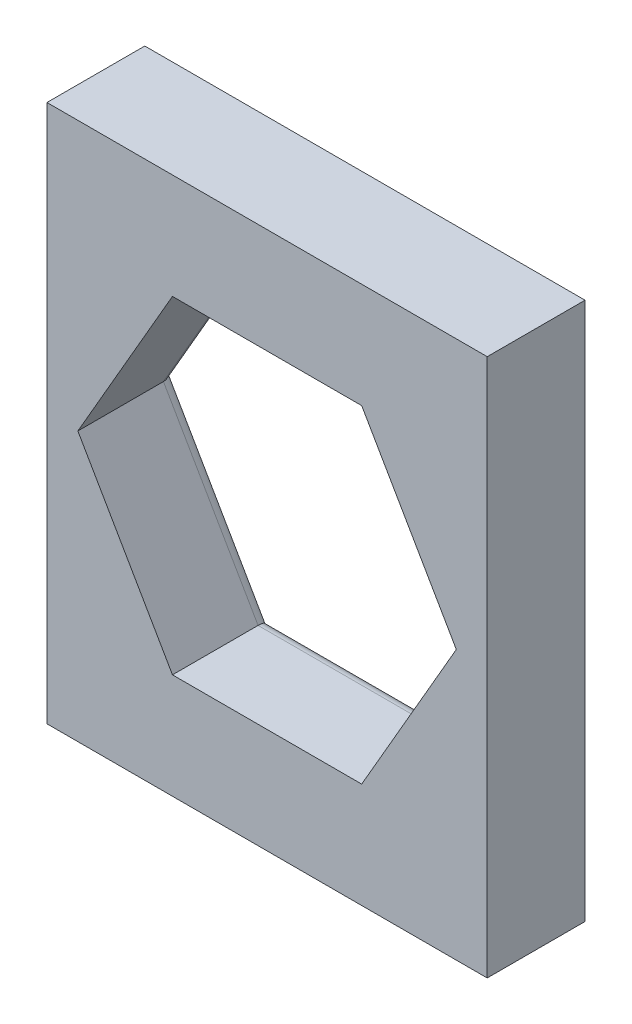
ISO-10303-21;
HEADER;
FILE_DESCRIPTION(('STEP AP214'),'2;1');
FILE_NAME('part.step','',(''),(''),'','','');
FILE_SCHEMA(('AUTOMOTIVE_DESIGN { 1 0 10303 214 1 1 1 1 }'));
ENDSEC;
DATA;
#1=APPLICATION_CONTEXT('core data for automotive mechanical design processes');
#2=APPLICATION_PROTOCOL_DEFINITION('international standard','automotive_design',2000,#1);
#3=PRODUCT_CONTEXT('',#1,'mechanical');
#4=PRODUCT('Part','Part','',(#3));
#5=PRODUCT_RELATED_PRODUCT_CATEGORY('part','',(#4));
#6=PRODUCT_DEFINITION_FORMATION('','',#4);
#7=PRODUCT_DEFINITION_CONTEXT('part definition',#1,'design');
#8=PRODUCT_DEFINITION('design','',#6,#7);
#9=PRODUCT_DEFINITION_SHAPE('','',#8);
#10=(LENGTH_UNIT() NAMED_UNIT(*) SI_UNIT(.MILLI.,.METRE.));
#11=(NAMED_UNIT(*) PLANE_ANGLE_UNIT() SI_UNIT($,.RADIAN.));
#12=(NAMED_UNIT(*) SI_UNIT($,.STERADIAN.) SOLID_ANGLE_UNIT());
#13=UNCERTAINTY_MEASURE_WITH_UNIT(LENGTH_MEASURE(1.E-05),#10,'distance_accuracy_value','');
#14=(GEOMETRIC_REPRESENTATION_CONTEXT(3) GLOBAL_UNCERTAINTY_ASSIGNED_CONTEXT((#13)) GLOBAL_UNIT_ASSIGNED_CONTEXT((#10,
#11,#12)) REPRESENTATION_CONTEXT('',''));
#15=CARTESIAN_POINT('',(0.,0.,0.));
#16=DIRECTION('',(0.,0.,1.));
#17=DIRECTION('',(1.,0.,0.));
#18=AXIS2_PLACEMENT_3D('',#15,#16,#17);
#19=CARTESIAN_POINT('',(53.6875782465025,43.1093909877878,89.839785791764));
#20=DIRECTION('',(0.,1.,0.));
#21=DIRECTION('',(0.,0.,1.));
#22=AXIS2_PLACEMENT_3D('',#19,#20,#21);
#23=PLANE('',#22);
#24=DIRECTION('',(1.,0.,0.));
#25=VECTOR('',#24,1.);
#26=CARTESIAN_POINT('',(53.6875782465025,43.1093909877878,87.139785791764));
#27=LINE('',#26,#25);
#28=CARTESIAN_POINT('',(53.6875782465025,43.1093909877878,87.139785791764));
#29=VERTEX_POINT('',#28);
#30=CARTESIAN_POINT('',(61.4240718536434,43.1093909877878,87.139785791764));
#31=VERTEX_POINT('',#30);
#32=EDGE_CURVE('E151',#29,#31,#27,.T.);
#33=ORIENTED_EDGE('',*,*,#32,.F.);
#34=DIRECTION('',(0.,0.,-1.));
#35=VECTOR('',#34,1.);
#36=CARTESIAN_POINT('',(53.6875782465025,43.1093909877878,89.839785791764));
#37=LINE('',#36,#35);
#38=CARTESIAN_POINT('',(53.6875782465025,43.1093909877878,83.639785791764));
#39=VERTEX_POINT('',#38);
#40=EDGE_CURVE('E199',#29,#39,#37,.T.);
#41=ORIENTED_EDGE('',*,*,#40,.T.);
#42=DIRECTION('',(1.,0.,0.));
#43=VECTOR('',#42,1.);
#44=CARTESIAN_POINT('',(61.4240718536434,43.1093909877878,83.639785791764));
#45=LINE('',#44,#43);
#46=CARTESIAN_POINT('',(61.4240718536434,43.1093909877878,83.639785791764));
#47=VERTEX_POINT('',#46);
#48=EDGE_CURVE('E223',#39,#47,#45,.T.);
#49=ORIENTED_EDGE('',*,*,#48,.T.);
#50=DIRECTION('',(0.,0.,-1.));
#51=VECTOR('',#50,1.);
#52=CARTESIAN_POINT('',(61.4240718536434,43.1093909877878,89.839785791764));
#53=LINE('',#52,#51);
#54=EDGE_CURVE('E197',#31,#47,#53,.T.);
#55=ORIENTED_EDGE('',*,*,#54,.F.);
#56=EDGE_LOOP('',(#33,#41,#49,#55));
#57=FACE_BOUND('',#56,.T.);
#58=ADVANCED_FACE('F41',(#57),#23,.F.);
#59=CARTESIAN_POINT('',(61.4240718536434,43.1093909877878,89.839785791764));
#60=DIRECTION('',(0.866025403784439,0.5,0.));
#61=DIRECTION('',(-0.5,0.866025403784439,0.));
#62=AXIS2_PLACEMENT_3D('',#59,#60,#61);
#63=PLANE('',#62);
#64=DIRECTION('',(0.5,-0.866025403784439,0.));
#65=VECTOR('',#64,1.);
#66=CARTESIAN_POINT('',(61.4240718536434,43.1093909877878,87.139785791764));
#67=LINE('',#66,#65);
#68=CARTESIAN_POINT('',(65.292318657214,36.4093909877877,87.139785791764));
#69=VERTEX_POINT('',#68);
#70=EDGE_CURVE('E188',#31,#69,#67,.T.);
#71=ORIENTED_EDGE('',*,*,#70,.F.);
#72=ORIENTED_EDGE('',*,*,#54,.T.);
#73=DIRECTION('',(0.5,-0.866025403784439,0.));
#74=VECTOR('',#73,1.);
#75=CARTESIAN_POINT('',(65.292318657214,36.4093909877877,83.639785791764));
#76=LINE('',#75,#74);
#77=CARTESIAN_POINT('',(65.292318657214,36.4093909877877,83.639785791764));
#78=VERTEX_POINT('',#77);
#79=EDGE_CURVE('E226',#47,#78,#76,.T.);
#80=ORIENTED_EDGE('',*,*,#79,.T.);
#81=DIRECTION('',(0.,0.,-1.));
#82=VECTOR('',#81,1.);
#83=CARTESIAN_POINT('',(65.292318657214,36.4093909877877,89.839785791764));
#84=LINE('',#83,#82);
#85=EDGE_CURVE('E195',#69,#78,#84,.T.);
#86=ORIENTED_EDGE('',*,*,#85,.F.);
#87=EDGE_LOOP('',(#71,#72,#80,#86));
#88=FACE_BOUND('',#87,.T.);
#89=ADVANCED_FACE('F287',(#88),#63,.F.);
#90=CARTESIAN_POINT('',(65.292318657214,36.4093909877877,89.839785791764));
#91=DIRECTION('',(0.866025403784438,-0.5,0.));
#92=DIRECTION('',(0.5,0.866025403784438,0.));
#93=AXIS2_PLACEMENT_3D('',#90,#91,#92);
#94=PLANE('',#93);
#95=DIRECTION('',(-0.5,-0.866025403784438,0.));
#96=VECTOR('',#95,1.);
#97=CARTESIAN_POINT('',(65.292318657214,36.4093909877877,87.139785791764));
#98=LINE('',#97,#96);
#99=CARTESIAN_POINT('',(61.4240718536434,29.7093909877877,87.139785791764));
#100=VERTEX_POINT('',#99);
#101=EDGE_CURVE('E186',#69,#100,#98,.T.);
#102=ORIENTED_EDGE('',*,*,#101,.F.);
#103=ORIENTED_EDGE('',*,*,#85,.T.);
#104=DIRECTION('',(-0.5,-0.866025403784438,0.));
#105=VECTOR('',#104,1.);
#106=CARTESIAN_POINT('',(61.4240718536434,29.7093909877877,83.639785791764));
#107=LINE('',#106,#105);
#108=CARTESIAN_POINT('',(61.4240718536434,29.7093909877877,83.639785791764));
#109=VERTEX_POINT('',#108);
#110=EDGE_CURVE('E12',#78,#109,#107,.T.);
#111=ORIENTED_EDGE('',*,*,#110,.T.);
#112=DIRECTION('',(0.,0.,-1.));
#113=VECTOR('',#112,1.);
#114=CARTESIAN_POINT('',(61.4240718536434,29.7093909877877,89.839785791764));
#115=LINE('',#114,#113);
#116=EDGE_CURVE('E66',#100,#109,#115,.T.);
#117=ORIENTED_EDGE('',*,*,#116,.F.);
#118=EDGE_LOOP('',(#102,#103,#111,#117));
#119=FACE_BOUND('',#118,.T.);
#120=ADVANCED_FACE('F289',(#119),#94,.F.);
#121=CARTESIAN_POINT('',(61.4240718536434,29.7093909877877,89.839785791764));
#122=DIRECTION('',(0.,-1.,0.));
#123=DIRECTION('',(1.,0.,0.));
#124=AXIS2_PLACEMENT_3D('',#121,#122,#123);
#125=PLANE('',#124);
#126=DIRECTION('',(-1.,0.,0.));
#127=VECTOR('',#126,1.);
#128=CARTESIAN_POINT('',(61.4240718536434,29.7093909877877,87.139785791764));
#129=LINE('',#128,#127);
#130=CARTESIAN_POINT('',(53.6875782465024,29.7093909877877,87.139785791764));
#131=VERTEX_POINT('',#130);
#132=EDGE_CURVE('E184',#100,#131,#129,.T.);
#133=ORIENTED_EDGE('',*,*,#132,.F.);
#134=ORIENTED_EDGE('',*,*,#116,.T.);
#135=DIRECTION('',(-1.,0.,0.));
#136=VECTOR('',#135,1.);
#137=CARTESIAN_POINT('',(53.6875782465024,29.7093909877877,83.639785791764));
#138=LINE('',#137,#136);
#139=CARTESIAN_POINT('',(53.6875782465024,29.7093909877877,83.639785791764));
#140=VERTEX_POINT('',#139);
#141=EDGE_CURVE('E50',#109,#140,#138,.T.);
#142=ORIENTED_EDGE('',*,*,#141,.T.);
#143=DIRECTION('',(0.,0.,-1.));
#144=VECTOR('',#143,1.);
#145=CARTESIAN_POINT('',(53.6875782465024,29.7093909877877,89.839785791764));
#146=LINE('',#145,#144);
#147=EDGE_CURVE('E203',#131,#140,#146,.T.);
#148=ORIENTED_EDGE('',*,*,#147,.F.);
#149=EDGE_LOOP('',(#133,#134,#142,#148));
#150=FACE_BOUND('',#149,.T.);
#151=ADVANCED_FACE('F264',(#150),#125,.F.);
#152=CARTESIAN_POINT('',(53.6875782465024,29.7093909877877,89.839785791764));
#153=DIRECTION('',(-0.866025403784439,-0.5,0.));
#154=DIRECTION('',(0.5,-0.866025403784439,0.));
#155=AXIS2_PLACEMENT_3D('',#152,#153,#154);
#156=PLANE('',#155);
#157=DIRECTION('',(-0.5,0.866025403784439,0.));
#158=VECTOR('',#157,1.);
#159=CARTESIAN_POINT('',(53.6875782465024,29.7093909877877,87.139785791764));
#160=LINE('',#159,#158);
#161=CARTESIAN_POINT('',(49.8193314429319,36.4093909877877,87.139785791764));
#162=VERTEX_POINT('',#161);
#163=EDGE_CURVE('E58',#131,#162,#160,.T.);
#164=ORIENTED_EDGE('',*,*,#163,.F.);
#165=ORIENTED_EDGE('',*,*,#147,.T.);
#166=DIRECTION('',(-0.5,0.866025403784439,0.));
#167=VECTOR('',#166,1.);
#168=CARTESIAN_POINT('',(49.8193314429319,36.4093909877877,83.639785791764));
#169=LINE('',#168,#167);
#170=CARTESIAN_POINT('',(49.8193314429319,36.4093909877877,83.639785791764));
#171=VERTEX_POINT('',#170);
#172=EDGE_CURVE('E194',#140,#171,#169,.T.);
#173=ORIENTED_EDGE('',*,*,#172,.T.);
#174=DIRECTION('',(0.,0.,-1.));
#175=VECTOR('',#174,1.);
#176=CARTESIAN_POINT('',(49.8193314429319,36.4093909877877,89.839785791764));
#177=LINE('',#176,#175);
#178=EDGE_CURVE('E201',#162,#171,#177,.T.);
#179=ORIENTED_EDGE('',*,*,#178,.F.);
#180=EDGE_LOOP('',(#164,#165,#173,#179));
#181=FACE_BOUND('',#180,.T.);
#182=ADVANCED_FACE('F266',(#181),#156,.F.);
#183=CARTESIAN_POINT('',(49.8193314429319,36.4093909877877,89.839785791764));
#184=DIRECTION('',(-0.866025403784439,0.5,0.));
#185=DIRECTION('',(-0.5,-0.866025403784439,0.));
#186=AXIS2_PLACEMENT_3D('',#183,#184,#185);
#187=PLANE('',#186);
#188=DIRECTION('',(0.5,0.866025403784439,0.));
#189=VECTOR('',#188,1.);
#190=CARTESIAN_POINT('',(49.8193314429319,36.4093909877877,87.139785791764));
#191=LINE('',#190,#189);
#192=EDGE_CURVE('E181',#162,#29,#191,.T.);
#193=ORIENTED_EDGE('',*,*,#192,.F.);
#194=ORIENTED_EDGE('',*,*,#178,.T.);
#195=DIRECTION('',(0.5,0.866025403784439,0.));
#196=VECTOR('',#195,1.);
#197=CARTESIAN_POINT('',(53.6875782465025,43.1093909877878,83.639785791764));
#198=LINE('',#197,#196);
#199=EDGE_CURVE('E220',#171,#39,#198,.T.);
#200=ORIENTED_EDGE('',*,*,#199,.T.);
#201=ORIENTED_EDGE('',*,*,#40,.F.);
#202=EDGE_LOOP('',(#193,#194,#200,#201));
#203=FACE_BOUND('',#202,.T.);
#204=ADVANCED_FACE('F269',(#203),#187,.F.);
#205=CARTESIAN_POINT('',(48.5558250500729,45.4093909877877,131.180666914685));
#206=DIRECTION('',(1.,0.,0.));
#207=DIRECTION('',(0.,0.,-1.));
#208=AXIS2_PLACEMENT_3D('',#205,#206,#207);
#209=PLANE('',#208);
#210=DIRECTION('',(0.,-1.,0.));
#211=VECTOR('',#210,1.);
#212=CARTESIAN_POINT('',(48.5558250500729,45.4093909877877,87.139785791764));
#213=LINE('',#212,#211);
#214=CARTESIAN_POINT('',(48.5558250500729,47.4093909877877,87.139785791764));
#215=VERTEX_POINT('',#214);
#216=CARTESIAN_POINT('',(48.5558250500729,25.4093909877877,87.139785791764));
#217=VERTEX_POINT('',#216);
#218=EDGE_CURVE('E179',#215,#217,#213,.T.);
#219=ORIENTED_EDGE('',*,*,#218,.F.);
#220=DIRECTION('',(0.,0.,1.));
#221=VECTOR('',#220,1.);
#222=CARTESIAN_POINT('',(48.5558250500729,47.4093909877877,65.0290155154891));
#223=LINE('',#222,#221);
#224=CARTESIAN_POINT('',(48.5558250500729,47.4093909877877,83.139785791764));
#225=VERTEX_POINT('',#224);
#226=EDGE_CURVE('E146',#225,#215,#223,.T.);
#227=ORIENTED_EDGE('',*,*,#226,.F.);
#228=DIRECTION('',(0.,-1.,0.));
#229=VECTOR('',#228,1.);
#230=CARTESIAN_POINT('',(48.5558250500729,0.,83.139785791764));
#231=LINE('',#230,#229);
#232=CARTESIAN_POINT('',(48.5558250500729,25.4093909877877,83.139785791764));
#233=VERTEX_POINT('',#232);
#234=EDGE_CURVE('E139',#225,#233,#231,.T.);
#235=ORIENTED_EDGE('',*,*,#234,.T.);
#236=DIRECTION('',(0.,0.,1.));
#237=VECTOR('',#236,1.);
#238=CARTESIAN_POINT('',(48.5558250500729,25.4093909877877,65.0290155154891));
#239=LINE('',#238,#237);
#240=EDGE_CURVE('E143',#233,#217,#239,.T.);
#241=ORIENTED_EDGE('',*,*,#240,.T.);
#242=EDGE_LOOP('',(#219,#227,#235,#241));
#243=FACE_BOUND('',#242,.T.);
#244=ADVANCED_FACE('F141',(#243),#209,.F.);
#245=CARTESIAN_POINT('',(66.5558250500729,45.4093909877877,131.180666914685));
#246=DIRECTION('',(-1.,0.,0.));
#247=DIRECTION('',(0.,0.,1.));
#248=AXIS2_PLACEMENT_3D('',#245,#246,#247);
#249=PLANE('',#248);
#250=DIRECTION('',(0.,1.,0.));
#251=VECTOR('',#250,1.);
#252=CARTESIAN_POINT('',(66.5558250500729,45.4093909877877,87.139785791764));
#253=LINE('',#252,#251);
#254=CARTESIAN_POINT('',(66.5558250500729,25.4093909877877,87.139785791764));
#255=VERTEX_POINT('',#254);
#256=CARTESIAN_POINT('',(66.5558250500729,47.4093909877877,87.139785791764));
#257=VERTEX_POINT('',#256);
#258=EDGE_CURVE('E177',#255,#257,#253,.T.);
#259=ORIENTED_EDGE('',*,*,#258,.F.);
#260=DIRECTION('',(0.,0.,1.));
#261=VECTOR('',#260,1.);
#262=CARTESIAN_POINT('',(66.5558250500729,25.4093909877877,65.0290155154891));
#263=LINE('',#262,#261);
#264=CARTESIAN_POINT('',(66.5558250500729,25.4093909877877,83.139785791764));
#265=VERTEX_POINT('',#264);
#266=EDGE_CURVE('E164',#265,#255,#263,.T.);
#267=ORIENTED_EDGE('',*,*,#266,.F.);
#268=DIRECTION('',(0.,1.,0.));
#269=VECTOR('',#268,1.);
#270=CARTESIAN_POINT('',(66.5558250500729,0.,83.139785791764));
#271=LINE('',#270,#269);
#272=CARTESIAN_POINT('',(66.5558250500729,47.4093909877877,83.139785791764));
#273=VERTEX_POINT('',#272);
#274=EDGE_CURVE('E150',#265,#273,#271,.T.);
#275=ORIENTED_EDGE('',*,*,#274,.T.);
#276=DIRECTION('',(0.,0.,1.));
#277=VECTOR('',#276,1.);
#278=CARTESIAN_POINT('',(66.5558250500729,47.4093909877877,65.0290155154891));
#279=LINE('',#278,#277);
#280=EDGE_CURVE('E171',#273,#257,#279,.T.);
#281=ORIENTED_EDGE('',*,*,#280,.T.);
#282=EDGE_LOOP('',(#259,#267,#275,#281));
#283=FACE_BOUND('',#282,.T.);
#284=ADVANCED_FACE('F318',(#283),#249,.F.);
#285=CARTESIAN_POINT('',(53.6875782465025,43.6093909877878,83.639785791764));
#286=DIRECTION('',(-1.,0.,0.));
#287=DIRECTION('',(0.,0.,1.));
#288=AXIS2_PLACEMENT_3D('',#285,#286,#287);
#289=CYLINDRICAL_SURFACE('',#288,0.5);
#290=CARTESIAN_POINT('',(61.7127469882383,43.6093909877878,83.639785791764));
#291=DIRECTION('',(-0.866025403784439,0.5,0.));
#292=DIRECTION('',(-0.5,-0.866025403784439,0.));
#293=AXIS2_PLACEMENT_3D('',#290,#291,#292);
#294=ELLIPSE('',#293,0.577350269189626,0.5);
#295=CARTESIAN_POINT('',(61.7127469882383,43.6093909877878,83.139785791764));
#296=VERTEX_POINT('',#295);
#297=EDGE_CURVE('E239',#296,#47,#294,.T.);
#298=ORIENTED_EDGE('',*,*,#297,.T.);
#299=ORIENTED_EDGE('',*,*,#48,.F.);
#300=CARTESIAN_POINT('',(53.3989031119076,43.6093909877878,83.639785791764));
#301=DIRECTION('',(-0.866025403784439,-0.5,0.));
#302=DIRECTION('',(0.5,-0.866025403784439,0.));
#303=AXIS2_PLACEMENT_3D('',#300,#301,#302);
#304=ELLIPSE('',#303,0.577350269189626,0.5);
#305=CARTESIAN_POINT('',(53.3989031119076,43.6093909877878,83.139785791764));
#306=VERTEX_POINT('',#305);
#307=EDGE_CURVE('E234',#306,#39,#304,.T.);
#308=ORIENTED_EDGE('',*,*,#307,.F.);
#309=DIRECTION('',(1.,0.,0.));
#310=VECTOR('',#309,1.);
#311=CARTESIAN_POINT('',(53.6875782465025,43.6093909877878,83.139785791764));
#312=LINE('',#311,#310);
#313=EDGE_CURVE('E213',#296,#306,#312,.F.);
#314=ORIENTED_EDGE('',*,*,#313,.F.);
#315=EDGE_LOOP('',(#298,#299,#308,#314));
#316=FACE_BOUND('',#315,.T.);
#317=ADVANCED_FACE('F278',(#316),#289,.T.);
#318=CARTESIAN_POINT('',(61.8570845555357,43.3593909877878,83.639785791764));
#319=DIRECTION('',(-0.5,0.866025403784439,0.));
#320=DIRECTION('',(-0.866025403784439,-0.5,0.));
#321=AXIS2_PLACEMENT_3D('',#318,#319,#320);
#322=CYLINDRICAL_SURFACE('',#321,0.5);
#323=ORIENTED_EDGE('',*,*,#297,.F.);
#324=DIRECTION('',(0.5,-0.866025403784439,0.));
#325=VECTOR('',#324,1.);
#326=CARTESIAN_POINT('',(61.8570845555357,43.3593909877878,83.139785791764));
#327=LINE('',#326,#325);
#328=CARTESIAN_POINT('',(65.8696689264036,36.4093909877877,83.139785791764));
#329=VERTEX_POINT('',#328);
#330=EDGE_CURVE('E211',#329,#296,#327,.F.);
#331=ORIENTED_EDGE('',*,*,#330,.F.);
#332=CARTESIAN_POINT('',(65.8696689264036,36.4093909877877,83.639785791764));
#333=DIRECTION('',(0.,1.,0.));
#334=DIRECTION('',(-1.,0.,0.));
#335=AXIS2_PLACEMENT_3D('',#332,#333,#334);
#336=ELLIPSE('',#335,0.577350269189626,0.5);
#337=EDGE_CURVE('E45',#78,#329,#336,.F.);
#338=ORIENTED_EDGE('',*,*,#337,.F.);
#339=ORIENTED_EDGE('',*,*,#79,.F.);
#340=EDGE_LOOP('',(#323,#331,#338,#339));
#341=FACE_BOUND('',#340,.T.);
#342=ADVANCED_FACE('F43',(#341),#322,.T.);
#343=CARTESIAN_POINT('',(65.7253313591062,36.1593909877877,83.639785791764));
#344=DIRECTION('',(0.5,0.866025403784438,0.));
#345=DIRECTION('',(-0.866025403784438,0.5,0.));
#346=AXIS2_PLACEMENT_3D('',#343,#344,#345);
#347=CYLINDRICAL_SURFACE('',#346,0.5);
#348=ORIENTED_EDGE('',*,*,#337,.T.);
#349=DIRECTION('',(-0.5,-0.866025403784438,0.));
#350=VECTOR('',#349,1.);
#351=CARTESIAN_POINT('',(65.7253313591062,36.1593909877877,83.139785791764));
#352=LINE('',#351,#350);
#353=CARTESIAN_POINT('',(61.7127469882383,29.2093909877877,83.139785791764));
#354=VERTEX_POINT('',#353);
#355=EDGE_CURVE('E207',#354,#329,#352,.F.);
#356=ORIENTED_EDGE('',*,*,#355,.F.);
#357=CARTESIAN_POINT('',(61.7127469882383,29.2093909877877,83.639785791764));
#358=DIRECTION('',(0.866025403784439,0.5,0.));
#359=DIRECTION('',(0.5,-0.866025403784439,0.));
#360=AXIS2_PLACEMENT_3D('',#357,#358,#359);
#361=ELLIPSE('',#360,0.577350269189626,0.5);
#362=EDGE_CURVE('E237',#109,#354,#361,.F.);
#363=ORIENTED_EDGE('',*,*,#362,.F.);
#364=ORIENTED_EDGE('',*,*,#110,.F.);
#365=EDGE_LOOP('',(#348,#356,#363,#364));
#366=FACE_BOUND('',#365,.T.);
#367=ADVANCED_FACE('F250',(#366),#347,.T.);
#368=CARTESIAN_POINT('',(61.4240718536434,29.2093909877877,83.639785791764));
#369=DIRECTION('',(1.,0.,0.));
#370=DIRECTION('',(0.,1.,0.));
#371=AXIS2_PLACEMENT_3D('',#368,#369,#370);
#372=CYLINDRICAL_SURFACE('',#371,0.5);
#373=ORIENTED_EDGE('',*,*,#362,.T.);
#374=DIRECTION('',(-1.,0.,0.));
#375=VECTOR('',#374,1.);
#376=CARTESIAN_POINT('',(61.4240718536434,29.2093909877877,83.139785791764));
#377=LINE('',#376,#375);
#378=CARTESIAN_POINT('',(53.3989031119076,29.2093909877877,83.139785791764));
#379=VERTEX_POINT('',#378);
#380=EDGE_CURVE('E209',#379,#354,#377,.F.);
#381=ORIENTED_EDGE('',*,*,#380,.F.);
#382=CARTESIAN_POINT('',(53.3989031119076,29.2093909877877,83.639785791764));
#383=DIRECTION('',(0.866025403784439,-0.5,0.));
#384=DIRECTION('',(-0.5,-0.866025403784439,0.));
#385=AXIS2_PLACEMENT_3D('',#382,#383,#384);
#386=ELLIPSE('',#385,0.577350269189626,0.5);
#387=EDGE_CURVE('E232',#140,#379,#386,.F.);
#388=ORIENTED_EDGE('',*,*,#387,.F.);
#389=ORIENTED_EDGE('',*,*,#141,.F.);
#390=EDGE_LOOP('',(#373,#381,#388,#389));
#391=FACE_BOUND('',#390,.T.);
#392=ADVANCED_FACE('F260',(#391),#372,.T.);
#393=CARTESIAN_POINT('',(53.2545655446102,29.4593909877877,83.639785791764));
#394=DIRECTION('',(0.5,-0.866025403784439,0.));
#395=DIRECTION('',(0.866025403784439,0.5,0.));
#396=AXIS2_PLACEMENT_3D('',#393,#394,#395);
#397=CYLINDRICAL_SURFACE('',#396,0.5);
#398=ORIENTED_EDGE('',*,*,#387,.T.);
#399=DIRECTION('',(-0.5,0.866025403784439,0.));
#400=VECTOR('',#399,1.);
#401=CARTESIAN_POINT('',(53.2545655446102,29.4593909877877,83.139785791764));
#402=LINE('',#401,#400);
#403=CARTESIAN_POINT('',(49.2419811737423,36.4093909877877,83.139785791764));
#404=VERTEX_POINT('',#403);
#405=EDGE_CURVE('E217',#404,#379,#402,.F.);
#406=ORIENTED_EDGE('',*,*,#405,.F.);
#407=CARTESIAN_POINT('',(49.2419811737423,36.4093909877877,83.639785791764));
#408=DIRECTION('',(0.,-1.,0.));
#409=DIRECTION('',(1.,0.,0.));
#410=AXIS2_PLACEMENT_3D('',#407,#408,#409);
#411=ELLIPSE('',#410,0.577350269189626,0.5);
#412=EDGE_CURVE('E192',#404,#171,#411,.T.);
#413=ORIENTED_EDGE('',*,*,#412,.T.);
#414=ORIENTED_EDGE('',*,*,#172,.F.);
#415=EDGE_LOOP('',(#398,#406,#413,#414));
#416=FACE_BOUND('',#415,.T.);
#417=ADVANCED_FACE('F274',(#416),#397,.T.);
#418=CARTESIAN_POINT('',(49.3863187410397,36.6593909877877,83.639785791764));
#419=DIRECTION('',(-0.5,-0.866025403784439,0.));
#420=DIRECTION('',(0.866025403784439,-0.5,0.));
#421=AXIS2_PLACEMENT_3D('',#418,#419,#420);
#422=CYLINDRICAL_SURFACE('',#421,0.5);
#423=ORIENTED_EDGE('',*,*,#307,.T.);
#424=ORIENTED_EDGE('',*,*,#199,.F.);
#425=ORIENTED_EDGE('',*,*,#412,.F.);
#426=DIRECTION('',(0.5,0.866025403784439,0.));
#427=VECTOR('',#426,1.);
#428=CARTESIAN_POINT('',(49.3863187410397,36.6593909877877,83.139785791764));
#429=LINE('',#428,#427);
#430=EDGE_CURVE('E215',#306,#404,#429,.F.);
#431=ORIENTED_EDGE('',*,*,#430,.F.);
#432=EDGE_LOOP('',(#423,#424,#425,#431));
#433=FACE_BOUND('',#432,.T.);
#434=ADVANCED_FACE('F277',(#433),#422,.T.);
#435=CARTESIAN_POINT('',(0.,0.,83.139785791764));
#436=DIRECTION('',(0.,0.,-1.));
#437=DIRECTION('',(-1.,0.,0.));
#438=AXIS2_PLACEMENT_3D('',#435,#436,#437);
#439=PLANE('',#438);
#440=ORIENTED_EDGE('',*,*,#274,.F.);
#441=DIRECTION('',(-1.,0.,0.));
#442=VECTOR('',#441,1.);
#443=CARTESIAN_POINT('',(0.,25.4093909877877,83.139785791764));
#444=LINE('',#443,#442);
#445=EDGE_CURVE('E154',#265,#233,#444,.T.);
#446=ORIENTED_EDGE('',*,*,#445,.T.);
#447=ORIENTED_EDGE('',*,*,#234,.F.);
#448=DIRECTION('',(-1.,0.,0.));
#449=VECTOR('',#448,1.);
#450=CARTESIAN_POINT('',(0.,47.4093909877877,83.139785791764));
#451=LINE('',#450,#449);
#452=EDGE_CURVE('E172',#273,#225,#451,.T.);
#453=ORIENTED_EDGE('',*,*,#452,.F.);
#454=EDGE_LOOP('',(#440,#446,#447,#453));
#455=FACE_BOUND('',#454,.T.);
#456=ORIENTED_EDGE('',*,*,#430,.T.);
#457=ORIENTED_EDGE('',*,*,#405,.T.);
#458=ORIENTED_EDGE('',*,*,#380,.T.);
#459=ORIENTED_EDGE('',*,*,#355,.T.);
#460=ORIENTED_EDGE('',*,*,#330,.T.);
#461=ORIENTED_EDGE('',*,*,#313,.T.);
#462=EDGE_LOOP('',(#456,#457,#458,#459,#460,#461));
#463=FACE_BOUND('',#462,.T.);
#464=ADVANCED_FACE('F155',(#455,#463),#439,.T.);
#465=CARTESIAN_POINT('',(48.5558250500729,45.4093909877877,87.139785791764));
#466=DIRECTION('',(0.,0.,1.));
#467=DIRECTION('',(1.,0.,0.));
#468=AXIS2_PLACEMENT_3D('',#465,#466,#467);
#469=PLANE('',#468);
#470=ORIENTED_EDGE('',*,*,#218,.T.);
#471=DIRECTION('',(-1.,0.,0.));
#472=VECTOR('',#471,1.);
#473=CARTESIAN_POINT('',(0.,25.4093909877877,87.139785791764));
#474=LINE('',#473,#472);
#475=EDGE_CURVE('E163',#255,#217,#474,.T.);
#476=ORIENTED_EDGE('',*,*,#475,.F.);
#477=ORIENTED_EDGE('',*,*,#258,.T.);
#478=DIRECTION('',(-1.,0.,0.));
#479=VECTOR('',#478,1.);
#480=CARTESIAN_POINT('',(0.,47.4093909877877,87.139785791764));
#481=LINE('',#480,#479);
#482=EDGE_CURVE('E168',#257,#215,#481,.T.);
#483=ORIENTED_EDGE('',*,*,#482,.T.);
#484=EDGE_LOOP('',(#470,#476,#477,#483));
#485=FACE_BOUND('',#484,.T.);
#486=ORIENTED_EDGE('',*,*,#32,.T.);
#487=ORIENTED_EDGE('',*,*,#70,.T.);
#488=ORIENTED_EDGE('',*,*,#101,.T.);
#489=ORIENTED_EDGE('',*,*,#132,.T.);
#490=ORIENTED_EDGE('',*,*,#163,.T.);
#491=ORIENTED_EDGE('',*,*,#192,.T.);
#492=EDGE_LOOP('',(#486,#487,#488,#489,#490,#491));
#493=FACE_BOUND('',#492,.T.);
#494=ADVANCED_FACE('F283',(#485,#493),#469,.T.);
#495=CARTESIAN_POINT('',(0.,47.4093909877877,65.0290155154891));
#496=DIRECTION('',(0.,1.,0.));
#497=DIRECTION('',(-1.,0.,0.));
#498=AXIS2_PLACEMENT_3D('',#495,#496,#497);
#499=PLANE('',#498);
#500=ORIENTED_EDGE('',*,*,#280,.F.);
#501=ORIENTED_EDGE('',*,*,#452,.T.);
#502=ORIENTED_EDGE('',*,*,#226,.T.);
#503=ORIENTED_EDGE('',*,*,#482,.F.);
#504=EDGE_LOOP('',(#500,#501,#502,#503));
#505=FACE_BOUND('',#504,.T.);
#506=ADVANCED_FACE('F408',(#505),#499,.T.);
#507=CARTESIAN_POINT('',(0.,25.4093909877877,65.0290155154891));
#508=DIRECTION('',(0.,1.,0.));
#509=DIRECTION('',(0.,0.,1.));
#510=AXIS2_PLACEMENT_3D('',#507,#508,#509);
#511=PLANE('',#510);
#512=ORIENTED_EDGE('',*,*,#445,.F.);
#513=ORIENTED_EDGE('',*,*,#266,.T.);
#514=ORIENTED_EDGE('',*,*,#475,.T.);
#515=ORIENTED_EDGE('',*,*,#240,.F.);
#516=EDGE_LOOP('',(#512,#513,#514,#515));
#517=FACE_BOUND('',#516,.T.);
#518=ADVANCED_FACE('F161',(#517),#511,.F.);
#519=CLOSED_SHELL('',(#58,#89,#120,#151,#182,#204,#244,#284,#317,#342,#367,#392,#417,#434,#464,
#494,#506,#518));
#520=MANIFOLD_SOLID_BREP('B2',#519);
#521=ADVANCED_BREP_SHAPE_REPRESENTATION('',(#18,#520),#14);
#522=SHAPE_DEFINITION_REPRESENTATION(#9,#521);
ENDSEC;
END-ISO-10303-21;
